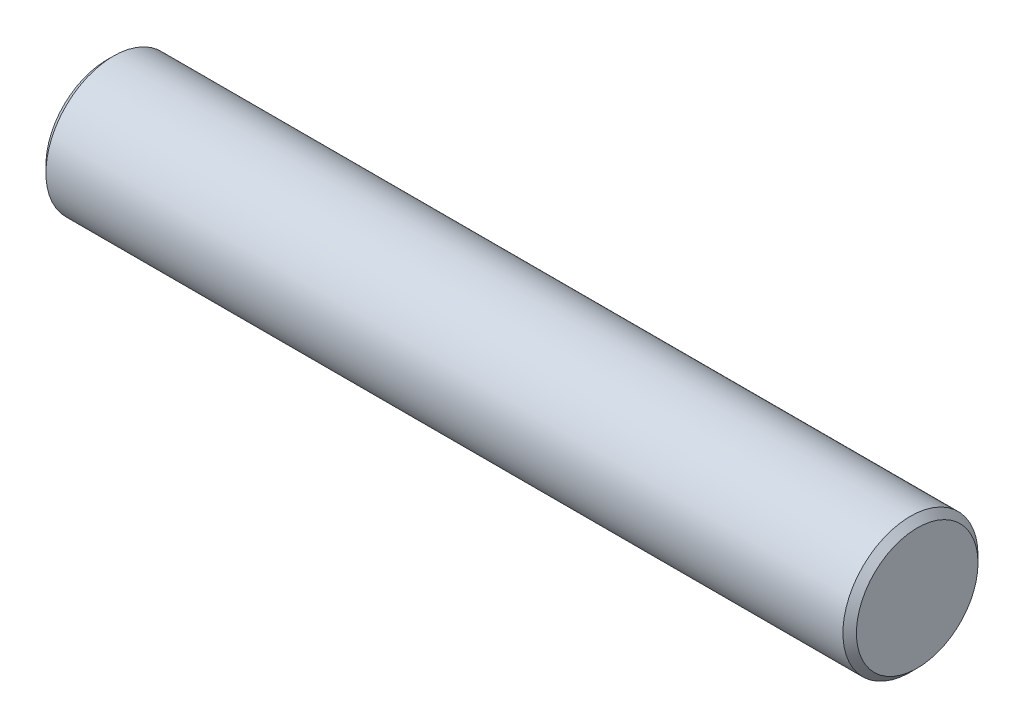
ISO-10303-21;
HEADER;
FILE_DESCRIPTION(('STEP AP214'),'2;1');
FILE_NAME('part.step','',(''),(''),'','','');
FILE_SCHEMA(('AUTOMOTIVE_DESIGN { 1 0 10303 214 1 1 1 1 }'));
ENDSEC;
DATA;
#1=APPLICATION_CONTEXT('core data for automotive mechanical design processes');
#2=APPLICATION_PROTOCOL_DEFINITION('international standard','automotive_design',2000,#1);
#3=PRODUCT_CONTEXT('',#1,'mechanical');
#4=PRODUCT('Part','Part','',(#3));
#5=PRODUCT_RELATED_PRODUCT_CATEGORY('part','',(#4));
#6=PRODUCT_DEFINITION_FORMATION('','',#4);
#7=PRODUCT_DEFINITION_CONTEXT('part definition',#1,'design');
#8=PRODUCT_DEFINITION('design','',#6,#7);
#9=PRODUCT_DEFINITION_SHAPE('','',#8);
#10=(LENGTH_UNIT() NAMED_UNIT(*) SI_UNIT(.MILLI.,.METRE.));
#11=(NAMED_UNIT(*) PLANE_ANGLE_UNIT() SI_UNIT($,.RADIAN.));
#12=(NAMED_UNIT(*) SI_UNIT($,.STERADIAN.) SOLID_ANGLE_UNIT());
#13=UNCERTAINTY_MEASURE_WITH_UNIT(LENGTH_MEASURE(1.E-05),#10,'distance_accuracy_value','');
#14=(GEOMETRIC_REPRESENTATION_CONTEXT(3) GLOBAL_UNCERTAINTY_ASSIGNED_CONTEXT((#13)) GLOBAL_UNIT_ASSIGNED_CONTEXT((#10,
#11,#12)) REPRESENTATION_CONTEXT('',''));
#15=CARTESIAN_POINT('',(0.,0.,0.));
#16=DIRECTION('',(0.,0.,1.));
#17=DIRECTION('',(1.,0.,0.));
#18=AXIS2_PLACEMENT_3D('',#15,#16,#17);
#19=CARTESIAN_POINT('',(6.,0.,0.));
#20=DIRECTION('',(-1.,0.,0.));
#21=DIRECTION('',(0.,0.,1.));
#22=AXIS2_PLACEMENT_3D('',#19,#20,#21);
#23=CYLINDRICAL_SURFACE('',#22,1.);
#24=CARTESIAN_POINT('',(5.9,0.,0.));
#25=DIRECTION('',(1.,0.,0.));
#26=DIRECTION('',(0.,0.,-1.));
#27=AXIS2_PLACEMENT_3D('',#24,#25,#26);
#28=CIRCLE('',#27,1.);
#29=CARTESIAN_POINT('',(5.9,0.,-1.));
#30=VERTEX_POINT('',#29);
#31=EDGE_CURVE('E41',#30,#30,#28,.F.);
#32=ORIENTED_EDGE('',*,*,#31,.T.);
#33=EDGE_LOOP('',(#32));
#34=FACE_BOUND('',#33,.T.);
#35=CARTESIAN_POINT('',(-5.9,0.,0.));
#36=DIRECTION('',(1.,0.,0.));
#37=DIRECTION('',(0.,0.,-1.));
#38=AXIS2_PLACEMENT_3D('',#35,#36,#37);
#39=CIRCLE('',#38,1.);
#40=CARTESIAN_POINT('',(-5.9,0.,-1.));
#41=VERTEX_POINT('',#40);
#42=EDGE_CURVE('E45',#41,#41,#39,.T.);
#43=ORIENTED_EDGE('',*,*,#42,.T.);
#44=EDGE_LOOP('',(#43));
#45=FACE_BOUND('',#44,.T.);
#46=ADVANCED_FACE('F33',(#34,#45),#23,.T.);
#47=CARTESIAN_POINT('',(6.,0.,0.));
#48=DIRECTION('',(1.,0.,0.));
#49=DIRECTION('',(0.,0.,-1.));
#50=AXIS2_PLACEMENT_3D('',#47,#48,#49);
#51=PLANE('',#50);
#52=CARTESIAN_POINT('',(6.,0.,0.));
#53=DIRECTION('',(1.,0.,0.));
#54=DIRECTION('',(0.,0.,-1.));
#55=AXIS2_PLACEMENT_3D('',#52,#53,#54);
#56=CIRCLE('',#55,0.9);
#57=CARTESIAN_POINT('',(6.,0.,-0.9));
#58=VERTEX_POINT('',#57);
#59=EDGE_CURVE('E49',#58,#58,#56,.T.);
#60=ORIENTED_EDGE('',*,*,#59,.T.);
#61=EDGE_LOOP('',(#60));
#62=FACE_BOUND('',#61,.T.);
#63=ADVANCED_FACE('F55',(#62),#51,.T.);
#64=CARTESIAN_POINT('',(-6.,0.,0.));
#65=DIRECTION('',(1.,0.,0.));
#66=DIRECTION('',(0.,0.,-1.));
#67=AXIS2_PLACEMENT_3D('',#64,#65,#66);
#68=PLANE('',#67);
#69=CARTESIAN_POINT('',(-6.,0.,0.));
#70=DIRECTION('',(1.,0.,0.));
#71=DIRECTION('',(0.,0.,-1.));
#72=AXIS2_PLACEMENT_3D('',#69,#70,#71);
#73=CIRCLE('',#72,0.9);
#74=CARTESIAN_POINT('',(-6.,0.,-0.9));
#75=VERTEX_POINT('',#74);
#76=EDGE_CURVE('E10',#75,#75,#73,.F.);
#77=ORIENTED_EDGE('',*,*,#76,.T.);
#78=EDGE_LOOP('',(#77));
#79=FACE_BOUND('',#78,.T.);
#80=ADVANCED_FACE('F59',(#79),#68,.F.);
#81=CARTESIAN_POINT('',(6.,0.,0.));
#82=DIRECTION('',(-1.,0.,0.));
#83=DIRECTION('',(0.,0.,1.));
#84=AXIS2_PLACEMENT_3D('',#81,#82,#83);
#85=CONICAL_SURFACE('',#84,0.9,0.78539816339744);
#86=ORIENTED_EDGE('',*,*,#31,.F.);
#87=EDGE_LOOP('',(#86));
#88=FACE_BOUND('',#87,.T.);
#89=ORIENTED_EDGE('',*,*,#59,.F.);
#90=EDGE_LOOP('',(#89));
#91=FACE_BOUND('',#90,.T.);
#92=ADVANCED_FACE('F57',(#88,#91),#85,.T.);
#93=CARTESIAN_POINT('',(-5.9,0.,0.));
#94=DIRECTION('',(1.,0.,0.));
#95=DIRECTION('',(0.,0.,-1.));
#96=AXIS2_PLACEMENT_3D('',#93,#94,#95);
#97=CONICAL_SURFACE('',#96,1.,0.785398163397453);
#98=ORIENTED_EDGE('',*,*,#76,.F.);
#99=EDGE_LOOP('',(#98));
#100=FACE_BOUND('',#99,.T.);
#101=ORIENTED_EDGE('',*,*,#42,.F.);
#102=EDGE_LOOP('',(#101));
#103=FACE_BOUND('',#102,.T.);
#104=ADVANCED_FACE('F36',(#100,#103),#97,.T.);
#105=CLOSED_SHELL('',(#46,#63,#80,#92,#104));
#106=MANIFOLD_SOLID_BREP('B2',#105);
#107=ADVANCED_BREP_SHAPE_REPRESENTATION('',(#18,#106),#14);
#108=SHAPE_DEFINITION_REPRESENTATION(#9,#107);
ENDSEC;
END-ISO-10303-21;
